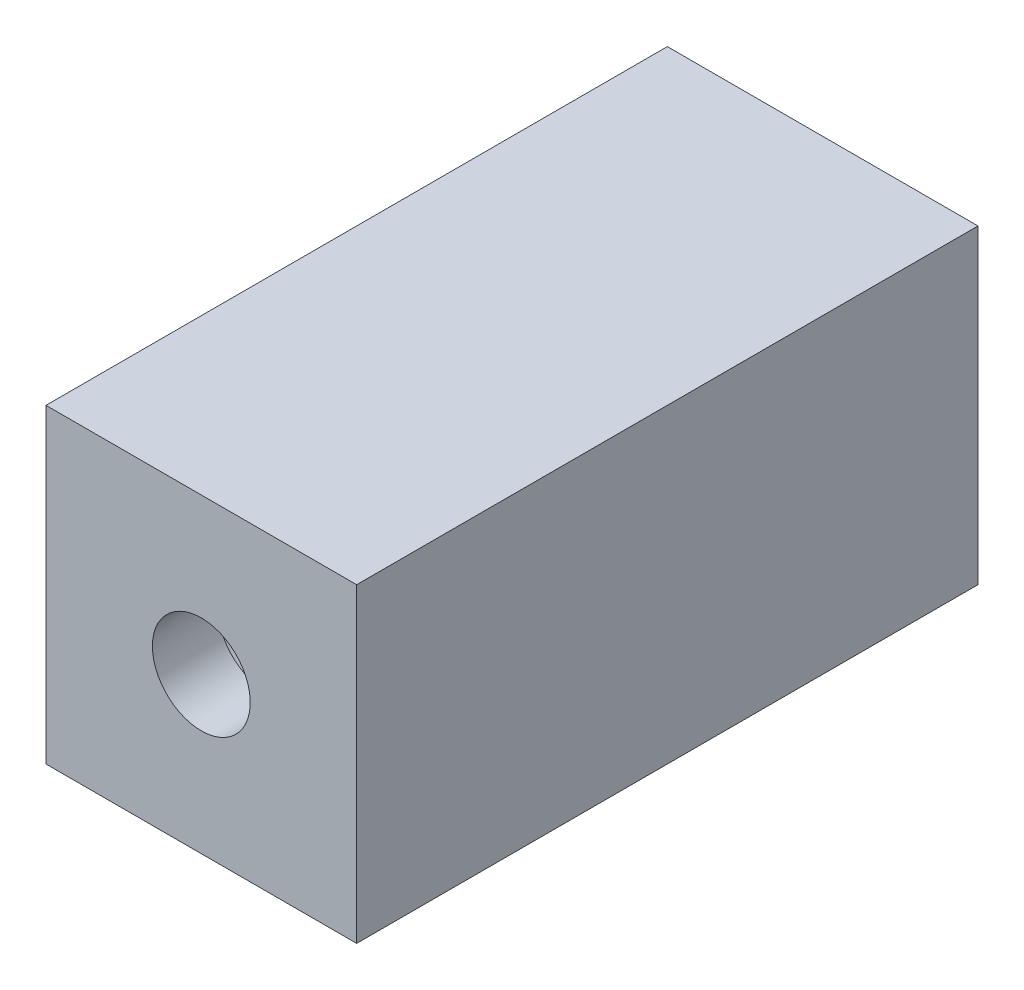
ISO-10303-21;
HEADER;
FILE_DESCRIPTION(('STEP AP214'),'2;1');
FILE_NAME('part.step','',(''),(''),'','','');
FILE_SCHEMA(('AUTOMOTIVE_DESIGN { 1 0 10303 214 1 1 1 1 }'));
ENDSEC;
DATA;
#1=APPLICATION_CONTEXT('core data for automotive mechanical design processes');
#2=APPLICATION_PROTOCOL_DEFINITION('international standard','automotive_design',2000,#1);
#3=PRODUCT_CONTEXT('',#1,'mechanical');
#4=PRODUCT('Part','Part','',(#3));
#5=PRODUCT_RELATED_PRODUCT_CATEGORY('part','',(#4));
#6=PRODUCT_DEFINITION_FORMATION('','',#4);
#7=PRODUCT_DEFINITION_CONTEXT('part definition',#1,'design');
#8=PRODUCT_DEFINITION('design','',#6,#7);
#9=PRODUCT_DEFINITION_SHAPE('','',#8);
#10=(LENGTH_UNIT() NAMED_UNIT(*) SI_UNIT(.MILLI.,.METRE.));
#11=(NAMED_UNIT(*) PLANE_ANGLE_UNIT() SI_UNIT($,.RADIAN.));
#12=(NAMED_UNIT(*) SI_UNIT($,.STERADIAN.) SOLID_ANGLE_UNIT());
#13=UNCERTAINTY_MEASURE_WITH_UNIT(LENGTH_MEASURE(1.E-05),#10,'distance_accuracy_value','');
#14=(GEOMETRIC_REPRESENTATION_CONTEXT(3) GLOBAL_UNCERTAINTY_ASSIGNED_CONTEXT((#13)) GLOBAL_UNIT_ASSIGNED_CONTEXT((#10,
#11,#12)) REPRESENTATION_CONTEXT('',''));
#15=CARTESIAN_POINT('',(0.,0.,0.));
#16=DIRECTION('',(0.,0.,1.));
#17=DIRECTION('',(1.,0.,0.));
#18=AXIS2_PLACEMENT_3D('',#15,#16,#17);
#19=CARTESIAN_POINT('',(12.7,0.,25.4));
#20=DIRECTION('',(0.,0.,-1.));
#21=DIRECTION('',(-1.,0.,0.));
#22=AXIS2_PLACEMENT_3D('',#19,#20,#21);
#23=CYLINDRICAL_SURFACE('',#22,4.);
#24=CARTESIAN_POINT('',(12.7,0.,-25.4));
#25=DIRECTION('',(0.,0.,-1.));
#26=DIRECTION('',(-1.,0.,0.));
#27=AXIS2_PLACEMENT_3D('',#24,#25,#26);
#28=CIRCLE('',#27,4.);
#29=CARTESIAN_POINT('',(8.7,0.,-25.4));
#30=VERTEX_POINT('',#29);
#31=EDGE_CURVE('E114',#30,#30,#28,.T.);
#32=ORIENTED_EDGE('',*,*,#31,.T.);
#33=EDGE_LOOP('',(#32));
#34=FACE_BOUND('',#33,.T.);
#35=CARTESIAN_POINT('',(12.7,0.,-18.5118386453003));
#36=DIRECTION('',(0.,0.,1.));
#37=DIRECTION('',(0.,-1.,0.));
#38=AXIS2_PLACEMENT_3D('',#35,#36,#37);
#39=CIRCLE('',#38,4.);
#40=CARTESIAN_POINT('',(12.7,-4.,-18.5118386453003));
#41=VERTEX_POINT('',#40);
#42=EDGE_CURVE('E37',#41,#41,#39,.F.);
#43=ORIENTED_EDGE('',*,*,#42,.F.);
#44=EDGE_LOOP('',(#43));
#45=FACE_BOUND('',#44,.T.);
#46=ADVANCED_FACE('F33',(#34,#45),#23,.F.);
#47=CARTESIAN_POINT('',(25.4,-12.7,25.4));
#48=DIRECTION('',(0.,0.,-1.));
#49=DIRECTION('',(-1.,0.,0.));
#50=AXIS2_PLACEMENT_3D('',#47,#48,#49);
#51=PLANE('',#50);
#52=CARTESIAN_POINT('',(12.7,0.,25.4));
#53=DIRECTION('',(0.,0.,-1.));
#54=DIRECTION('',(-1.,0.,0.));
#55=AXIS2_PLACEMENT_3D('',#52,#53,#54);
#56=CIRCLE('',#55,4.);
#57=CARTESIAN_POINT('',(8.7,0.,25.4));
#58=VERTEX_POINT('',#57);
#59=EDGE_CURVE('E103',#58,#58,#56,.T.);
#60=ORIENTED_EDGE('',*,*,#59,.T.);
#61=EDGE_LOOP('',(#60));
#62=FACE_BOUND('',#61,.T.);
#63=DIRECTION('',(0.,-1.,0.));
#64=VECTOR('',#63,1.);
#65=CARTESIAN_POINT('',(0.,-12.7,25.4));
#66=LINE('',#65,#64);
#67=CARTESIAN_POINT('',(0.,12.7,25.4));
#68=VERTEX_POINT('',#67);
#69=CARTESIAN_POINT('',(0.,-12.7,25.4));
#70=VERTEX_POINT('',#69);
#71=EDGE_CURVE('E100',#68,#70,#66,.T.);
#72=ORIENTED_EDGE('',*,*,#71,.T.);
#73=DIRECTION('',(-1.,0.,0.));
#74=VECTOR('',#73,1.);
#75=CARTESIAN_POINT('',(25.4,-12.7,25.4));
#76=LINE('',#75,#74);
#77=CARTESIAN_POINT('',(25.4,-12.7,25.4));
#78=VERTEX_POINT('',#77);
#79=EDGE_CURVE('E11',#78,#70,#76,.T.);
#80=ORIENTED_EDGE('',*,*,#79,.F.);
#81=DIRECTION('',(0.,-1.,0.));
#82=VECTOR('',#81,1.);
#83=CARTESIAN_POINT('',(25.4,-12.7,25.4));
#84=LINE('',#83,#82);
#85=CARTESIAN_POINT('',(25.4,12.7,25.4));
#86=VERTEX_POINT('',#85);
#87=EDGE_CURVE('E87',#86,#78,#84,.T.);
#88=ORIENTED_EDGE('',*,*,#87,.F.);
#89=DIRECTION('',(-1.,0.,0.));
#90=VECTOR('',#89,1.);
#91=CARTESIAN_POINT('',(25.4,12.7,25.4));
#92=LINE('',#91,#90);
#93=EDGE_CURVE('E96',#86,#68,#92,.T.);
#94=ORIENTED_EDGE('',*,*,#93,.T.);
#95=EDGE_LOOP('',(#72,#80,#88,#94));
#96=FACE_BOUND('',#95,.T.);
#97=ADVANCED_FACE('F35',(#62,#96),#51,.F.);
#98=CARTESIAN_POINT('',(25.4,-12.7,-25.4));
#99=DIRECTION('',(0.,1.,0.));
#100=DIRECTION('',(0.,0.,1.));
#101=AXIS2_PLACEMENT_3D('',#98,#99,#100);
#102=PLANE('',#101);
#103=DIRECTION('',(0.,0.,-1.));
#104=VECTOR('',#103,1.);
#105=CARTESIAN_POINT('',(0.,-12.7,-25.4));
#106=LINE('',#105,#104);
#107=CARTESIAN_POINT('',(0.,-12.7,-25.4));
#108=VERTEX_POINT('',#107);
#109=EDGE_CURVE('E91',#70,#108,#106,.T.);
#110=ORIENTED_EDGE('',*,*,#109,.T.);
#111=DIRECTION('',(-1.,0.,0.));
#112=VECTOR('',#111,1.);
#113=CARTESIAN_POINT('',(25.4,-12.7,-25.4));
#114=LINE('',#113,#112);
#115=CARTESIAN_POINT('',(25.4,-12.7,-25.4));
#116=VERTEX_POINT('',#115);
#117=EDGE_CURVE('E43',#116,#108,#114,.T.);
#118=ORIENTED_EDGE('',*,*,#117,.F.);
#119=DIRECTION('',(0.,0.,-1.));
#120=VECTOR('',#119,1.);
#121=CARTESIAN_POINT('',(25.4,-12.7,-25.4));
#122=LINE('',#121,#120);
#123=EDGE_CURVE('E82',#78,#116,#122,.T.);
#124=ORIENTED_EDGE('',*,*,#123,.F.);
#125=ORIENTED_EDGE('',*,*,#79,.T.);
#126=EDGE_LOOP('',(#110,#118,#124,#125));
#127=FACE_BOUND('',#126,.T.);
#128=ADVANCED_FACE('F90',(#127),#102,.F.);
#129=CARTESIAN_POINT('',(25.4,-12.7,-25.4));
#130=DIRECTION('',(0.,0.,1.));
#131=DIRECTION('',(1.,0.,0.));
#132=AXIS2_PLACEMENT_3D('',#129,#130,#131);
#133=PLANE('',#132);
#134=ORIENTED_EDGE('',*,*,#31,.F.);
#135=EDGE_LOOP('',(#134));
#136=FACE_BOUND('',#135,.T.);
#137=DIRECTION('',(0.,1.,0.));
#138=VECTOR('',#137,1.);
#139=CARTESIAN_POINT('',(0.,-12.7,-25.4));
#140=LINE('',#139,#138);
#141=CARTESIAN_POINT('',(0.,12.7,-25.4));
#142=VERTEX_POINT('',#141);
#143=EDGE_CURVE('E69',#108,#142,#140,.T.);
#144=ORIENTED_EDGE('',*,*,#143,.T.);
#145=DIRECTION('',(-1.,0.,0.));
#146=VECTOR('',#145,1.);
#147=CARTESIAN_POINT('',(25.4,12.7,-25.4));
#148=LINE('',#147,#146);
#149=CARTESIAN_POINT('',(25.4,12.7,-25.4));
#150=VERTEX_POINT('',#149);
#151=EDGE_CURVE('E92',#150,#142,#148,.T.);
#152=ORIENTED_EDGE('',*,*,#151,.F.);
#153=DIRECTION('',(0.,1.,0.));
#154=VECTOR('',#153,1.);
#155=CARTESIAN_POINT('',(25.4,-12.7,-25.4));
#156=LINE('',#155,#154);
#157=EDGE_CURVE('E85',#116,#150,#156,.T.);
#158=ORIENTED_EDGE('',*,*,#157,.F.);
#159=ORIENTED_EDGE('',*,*,#117,.T.);
#160=EDGE_LOOP('',(#144,#152,#158,#159));
#161=FACE_BOUND('',#160,.T.);
#162=ADVANCED_FACE('F94',(#136,#161),#133,.F.);
#163=CARTESIAN_POINT('',(25.4,12.7,-25.4));
#164=DIRECTION('',(0.,-1.,0.));
#165=DIRECTION('',(0.,0.,-1.));
#166=AXIS2_PLACEMENT_3D('',#163,#164,#165);
#167=PLANE('',#166);
#168=DIRECTION('',(0.,0.,1.));
#169=VECTOR('',#168,1.);
#170=CARTESIAN_POINT('',(0.,12.7,-25.4));
#171=LINE('',#170,#169);
#172=EDGE_CURVE('E75',#142,#68,#171,.T.);
#173=ORIENTED_EDGE('',*,*,#172,.T.);
#174=ORIENTED_EDGE('',*,*,#93,.F.);
#175=DIRECTION('',(0.,0.,1.));
#176=VECTOR('',#175,1.);
#177=CARTESIAN_POINT('',(25.4,12.7,-25.4));
#178=LINE('',#177,#176);
#179=EDGE_CURVE('E52',#150,#86,#178,.T.);
#180=ORIENTED_EDGE('',*,*,#179,.F.);
#181=ORIENTED_EDGE('',*,*,#151,.T.);
#182=EDGE_LOOP('',(#173,#174,#180,#181));
#183=FACE_BOUND('',#182,.T.);
#184=ADVANCED_FACE('F131',(#183),#167,.F.);
#185=CARTESIAN_POINT('',(25.4,0.,0.));
#186=DIRECTION('',(1.,0.,0.));
#187=DIRECTION('',(0.,0.,-1.));
#188=AXIS2_PLACEMENT_3D('',#185,#186,#187);
#189=PLANE('',#188);
#190=ORIENTED_EDGE('',*,*,#87,.T.);
#191=ORIENTED_EDGE('',*,*,#123,.T.);
#192=ORIENTED_EDGE('',*,*,#157,.T.);
#193=ORIENTED_EDGE('',*,*,#179,.T.);
#194=EDGE_LOOP('',(#190,#191,#192,#193));
#195=FACE_BOUND('',#194,.T.);
#196=ADVANCED_FACE('F83',(#195),#189,.T.);
#197=CARTESIAN_POINT('',(0.,0.,0.));
#198=DIRECTION('',(1.,0.,0.));
#199=DIRECTION('',(0.,0.,-1.));
#200=AXIS2_PLACEMENT_3D('',#197,#198,#199);
#201=PLANE('',#200);
#202=ORIENTED_EDGE('',*,*,#71,.F.);
#203=ORIENTED_EDGE('',*,*,#172,.F.);
#204=ORIENTED_EDGE('',*,*,#143,.F.);
#205=ORIENTED_EDGE('',*,*,#109,.F.);
#206=EDGE_LOOP('',(#202,#203,#204,#205));
#207=FACE_BOUND('',#206,.T.);
#208=ADVANCED_FACE('F149',(#207),#201,.F.);
#209=CARTESIAN_POINT('',(12.7,0.,20.0296998116016));
#210=DIRECTION('',(0.,0.,1.));
#211=DIRECTION('',(0.,-1.,0.));
#212=AXIS2_PLACEMENT_3D('',#209,#210,#211);
#213=CIRCLE('',#212,4.);
#214=CARTESIAN_POINT('',(12.7,-4.,20.0296998116016));
#215=VERTEX_POINT('',#214);
#216=EDGE_CURVE('E108',#215,#215,#213,.F.);
#217=ORIENTED_EDGE('',*,*,#216,.T.);
#218=EDGE_LOOP('',(#217));
#219=FACE_BOUND('',#218,.T.);
#220=ORIENTED_EDGE('',*,*,#59,.F.);
#221=EDGE_LOOP('',(#220));
#222=FACE_BOUND('',#221,.T.);
#223=ADVANCED_FACE('F140',(#219,#222),#23,.F.);
#224=CARTESIAN_POINT('',(0.,0.,-18.5118386453003));
#225=DIRECTION('',(0.,0.,1.));
#226=DIRECTION('',(0.,-1.,0.));
#227=AXIS2_PLACEMENT_3D('',#224,#225,#226);
#228=PLANE('',#227);
#229=CARTESIAN_POINT('',(12.7,0.,-18.5118386453003));
#230=DIRECTION('',(0.,0.,1.));
#231=DIRECTION('',(0.,-1.,0.));
#232=AXIS2_PLACEMENT_3D('',#229,#230,#231);
#233=CIRCLE('',#232,10.);
#234=CARTESIAN_POINT('',(12.7,-10.,-18.5118386453003));
#235=VERTEX_POINT('',#234);
#236=EDGE_CURVE('E110',#235,#235,#233,.T.);
#237=ORIENTED_EDGE('',*,*,#236,.T.);
#238=EDGE_LOOP('',(#237));
#239=FACE_BOUND('',#238,.T.);
#240=ORIENTED_EDGE('',*,*,#42,.T.);
#241=EDGE_LOOP('',(#240));
#242=FACE_BOUND('',#241,.T.);
#243=ADVANCED_FACE('F148',(#239,#242),#228,.T.);
#244=CARTESIAN_POINT('',(0.,0.,20.0296998116016));
#245=DIRECTION('',(0.,0.,1.));
#246=DIRECTION('',(0.,-1.,0.));
#247=AXIS2_PLACEMENT_3D('',#244,#245,#246);
#248=PLANE('',#247);
#249=CARTESIAN_POINT('',(12.7,0.,20.0296998116016));
#250=DIRECTION('',(0.,0.,1.));
#251=DIRECTION('',(0.,-1.,0.));
#252=AXIS2_PLACEMENT_3D('',#249,#250,#251);
#253=CIRCLE('',#252,10.);
#254=CARTESIAN_POINT('',(12.7,-10.,20.0296998116016));
#255=VERTEX_POINT('',#254);
#256=EDGE_CURVE('E116',#255,#255,#253,.T.);
#257=ORIENTED_EDGE('',*,*,#256,.F.);
#258=EDGE_LOOP('',(#257));
#259=FACE_BOUND('',#258,.T.);
#260=ORIENTED_EDGE('',*,*,#216,.F.);
#261=EDGE_LOOP('',(#260));
#262=FACE_BOUND('',#261,.T.);
#263=ADVANCED_FACE('F154',(#259,#262),#248,.F.);
#264=CARTESIAN_POINT('',(12.7,0.,25.4));
#265=DIRECTION('',(0.,0.,1.));
#266=DIRECTION('',(0.,-1.,0.));
#267=AXIS2_PLACEMENT_3D('',#264,#265,#266);
#268=CYLINDRICAL_SURFACE('',#267,10.);
#269=ORIENTED_EDGE('',*,*,#256,.T.);
#270=EDGE_LOOP('',(#269));
#271=FACE_BOUND('',#270,.T.);
#272=ORIENTED_EDGE('',*,*,#236,.F.);
#273=EDGE_LOOP('',(#272));
#274=FACE_BOUND('',#273,.T.);
#275=ADVANCED_FACE('F212',(#271,#274),#268,.F.);
#276=CLOSED_SHELL('',(#46,#97,#128,#162,#184,#196,#208,#223,#243,#263,#275));
#277=MANIFOLD_SOLID_BREP('B2',#276);
#278=ADVANCED_BREP_SHAPE_REPRESENTATION('',(#18,#277),#14);
#279=SHAPE_DEFINITION_REPRESENTATION(#9,#278);
ENDSEC;
END-ISO-10303-21;
